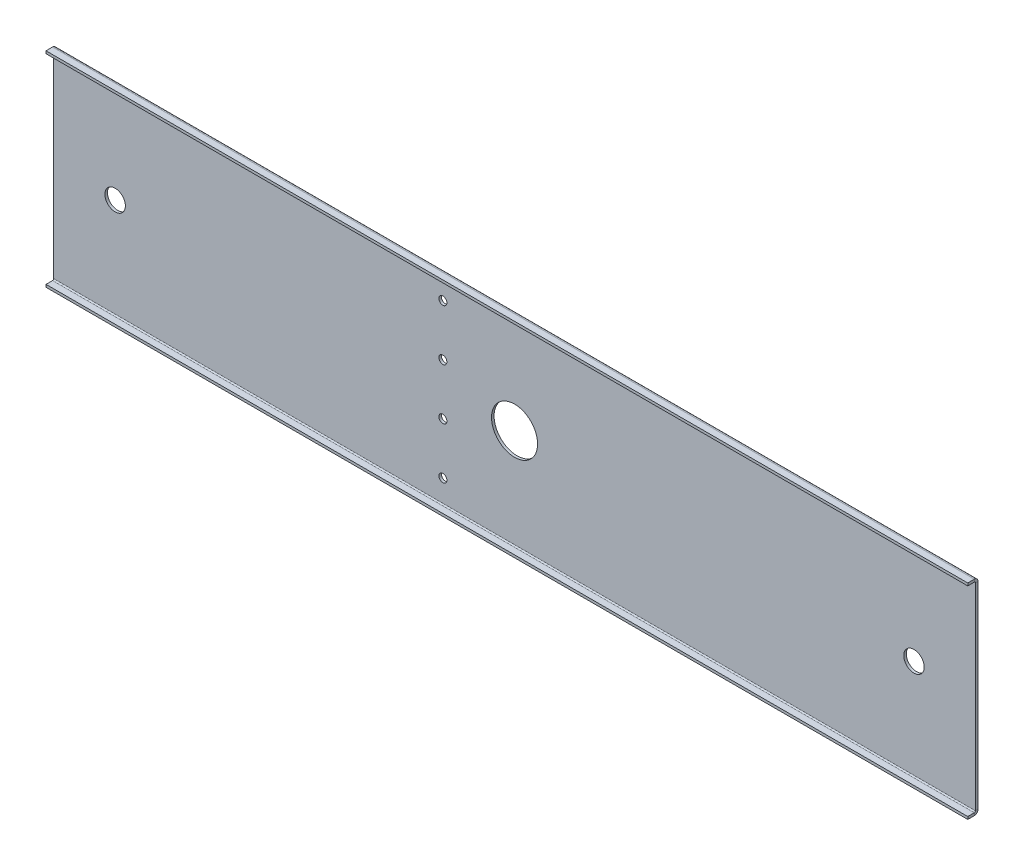
ISO-10303-21;
HEADER;
FILE_DESCRIPTION(('STEP AP214'),'2;1');
FILE_NAME('part.step','',(''),(''),'','','');
FILE_SCHEMA(('AUTOMOTIVE_DESIGN { 1 0 10303 214 1 1 1 1 }'));
ENDSEC;
DATA;
#1=APPLICATION_CONTEXT('core data for automotive mechanical design processes');
#2=APPLICATION_PROTOCOL_DEFINITION('international standard','automotive_design',2000,#1);
#3=PRODUCT_CONTEXT('',#1,'mechanical');
#4=PRODUCT('Part','Part','',(#3));
#5=PRODUCT_RELATED_PRODUCT_CATEGORY('part','',(#4));
#6=PRODUCT_DEFINITION_FORMATION('','',#4);
#7=PRODUCT_DEFINITION_CONTEXT('part definition',#1,'design');
#8=PRODUCT_DEFINITION('design','',#6,#7);
#9=PRODUCT_DEFINITION_SHAPE('','',#8);
#10=(LENGTH_UNIT() NAMED_UNIT(*) SI_UNIT(.MILLI.,.METRE.));
#11=(NAMED_UNIT(*) PLANE_ANGLE_UNIT() SI_UNIT($,.RADIAN.));
#12=(NAMED_UNIT(*) SI_UNIT($,.STERADIAN.) SOLID_ANGLE_UNIT());
#13=UNCERTAINTY_MEASURE_WITH_UNIT(LENGTH_MEASURE(1.E-05),#10,'distance_accuracy_value','');
#14=(GEOMETRIC_REPRESENTATION_CONTEXT(3) GLOBAL_UNCERTAINTY_ASSIGNED_CONTEXT((#13)) GLOBAL_UNIT_ASSIGNED_CONTEXT((#10,
#11,#12)) REPRESENTATION_CONTEXT('',''));
#15=CARTESIAN_POINT('',(0.,0.,0.));
#16=DIRECTION('',(0.,0.,1.));
#17=DIRECTION('',(1.,0.,0.));
#18=AXIS2_PLACEMENT_3D('',#15,#16,#17);
#19=CARTESIAN_POINT('',(0.,0.,47.3075));
#20=DIRECTION('',(0.,0.,1.));
#21=DIRECTION('',(1.,0.,0.));
#22=AXIS2_PLACEMENT_3D('',#19,#20,#21);
#23=PLANE('',#22);
#24=CARTESIAN_POINT('',(-44.45,47.625,47.3075));
#25=DIRECTION('',(0.,0.,1.));
#26=DIRECTION('',(1.,0.,0.));
#27=AXIS2_PLACEMENT_3D('',#24,#25,#26);
#28=CIRCLE('',#27,2.4892);
#29=CARTESIAN_POINT('',(-41.9608,47.625,47.3075));
#30=VERTEX_POINT('',#29);
#31=EDGE_CURVE('E636',#30,#30,#28,.T.);
#32=ORIENTED_EDGE('',*,*,#31,.F.);
#33=EDGE_LOOP('',(#32));
#34=FACE_BOUND('',#33,.T.);
#35=CARTESIAN_POINT('',(-44.45,15.875,47.3075));
#36=DIRECTION('',(0.,0.,1.));
#37=DIRECTION('',(1.,0.,0.));
#38=AXIS2_PLACEMENT_3D('',#35,#36,#37);
#39=CIRCLE('',#38,2.4892);
#40=CARTESIAN_POINT('',(-41.9608,15.875,47.3075));
#41=VERTEX_POINT('',#40);
#42=EDGE_CURVE('E630',#41,#41,#39,.T.);
#43=ORIENTED_EDGE('',*,*,#42,.F.);
#44=EDGE_LOOP('',(#43));
#45=FACE_BOUND('',#44,.T.);
#46=CARTESIAN_POINT('',(-44.45,-15.875,47.3075));
#47=DIRECTION('',(0.,0.,1.));
#48=DIRECTION('',(1.,0.,0.));
#49=AXIS2_PLACEMENT_3D('',#46,#47,#48);
#50=CIRCLE('',#49,2.4892);
#51=CARTESIAN_POINT('',(-41.9608,-15.875,47.3075));
#52=VERTEX_POINT('',#51);
#53=EDGE_CURVE('E623',#52,#52,#50,.T.);
#54=ORIENTED_EDGE('',*,*,#53,.F.);
#55=EDGE_LOOP('',(#54));
#56=FACE_BOUND('',#55,.T.);
#57=CARTESIAN_POINT('',(-44.45,-47.625,47.3075));
#58=DIRECTION('',(0.,0.,1.));
#59=DIRECTION('',(1.,0.,0.));
#60=AXIS2_PLACEMENT_3D('',#57,#58,#59);
#61=CIRCLE('',#60,2.4892);
#62=CARTESIAN_POINT('',(-41.9608,-47.625,47.3075));
#63=VERTEX_POINT('',#62);
#64=EDGE_CURVE('E624',#63,#63,#61,.T.);
#65=ORIENTED_EDGE('',*,*,#64,.F.);
#66=EDGE_LOOP('',(#65));
#67=FACE_BOUND('',#66,.T.);
#68=CARTESIAN_POINT('',(0.,0.,47.3075));
#69=DIRECTION('',(0.,0.,1.));
#70=DIRECTION('',(1.,0.,0.));
#71=AXIS2_PLACEMENT_3D('',#68,#69,#70);
#72=CIRCLE('',#71,14.2875);
#73=CARTESIAN_POINT('',(14.2875,0.,47.3075));
#74=VERTEX_POINT('',#73);
#75=EDGE_CURVE('E249',#74,#74,#72,.T.);
#76=ORIENTED_EDGE('',*,*,#75,.F.);
#77=EDGE_LOOP('',(#76));
#78=FACE_BOUND('',#77,.T.);
#79=CARTESIAN_POINT('',(-247.641580502809,0.,47.3075));
#80=DIRECTION('',(0.,0.,1.));
#81=DIRECTION('',(1.,0.,0.));
#82=AXIS2_PLACEMENT_3D('',#79,#80,#81);
#83=CIRCLE('',#82,6.35);
#84=CARTESIAN_POINT('',(-241.291580502809,0.,47.3075));
#85=VERTEX_POINT('',#84);
#86=EDGE_CURVE('E255',#85,#85,#83,.T.);
#87=ORIENTED_EDGE('',*,*,#86,.F.);
#88=EDGE_LOOP('',(#87));
#89=FACE_BOUND('',#88,.T.);
#90=CARTESIAN_POINT('',(247.641580502809,0.,47.3075));
#91=DIRECTION('',(0.,0.,1.));
#92=DIRECTION('',(1.,0.,0.));
#93=AXIS2_PLACEMENT_3D('',#90,#91,#92);
#94=CIRCLE('',#93,6.35);
#95=CARTESIAN_POINT('',(253.991580502809,0.,47.3075));
#96=VERTEX_POINT('',#95);
#97=EDGE_CURVE('E243',#96,#96,#94,.T.);
#98=ORIENTED_EDGE('',*,*,#97,.F.);
#99=EDGE_LOOP('',(#98));
#100=FACE_BOUND('',#99,.T.);
#101=DIRECTION('',(0.,-1.,0.));
#102=VECTOR('',#101,1.);
#103=CARTESIAN_POINT('',(-285.75,63.5,47.3075));
#104=LINE('',#103,#102);
#105=CARTESIAN_POINT('',(-285.75,61.1759,47.3075));
#106=VERTEX_POINT('',#105);
#107=CARTESIAN_POINT('',(-285.75,-61.1759,47.3075));
#108=VERTEX_POINT('',#107);
#109=EDGE_CURVE('E44',#106,#108,#104,.T.);
#110=ORIENTED_EDGE('',*,*,#109,.T.);
#111=DIRECTION('',(1.,0.,0.));
#112=VECTOR('',#111,1.);
#113=CARTESIAN_POINT('',(285.75,-61.1759,47.3075));
#114=LINE('',#113,#112);
#115=CARTESIAN_POINT('',(285.75,-61.1759,47.3075));
#116=VERTEX_POINT('',#115);
#117=EDGE_CURVE('E179',#116,#108,#114,.F.);
#118=ORIENTED_EDGE('',*,*,#117,.F.);
#119=DIRECTION('',(0.,1.,0.));
#120=VECTOR('',#119,1.);
#121=CARTESIAN_POINT('',(285.75,63.5,47.3075));
#122=LINE('',#121,#120);
#123=CARTESIAN_POINT('',(285.75,61.1759,47.3075));
#124=VERTEX_POINT('',#123);
#125=EDGE_CURVE('E11',#116,#124,#122,.T.);
#126=ORIENTED_EDGE('',*,*,#125,.T.);
#127=DIRECTION('',(-1.,0.,0.));
#128=VECTOR('',#127,1.);
#129=CARTESIAN_POINT('',(-285.75,61.1759,47.3075));
#130=LINE('',#129,#128);
#131=EDGE_CURVE('E232',#106,#124,#130,.F.);
#132=ORIENTED_EDGE('',*,*,#131,.F.);
#133=EDGE_LOOP('',(#110,#118,#126,#132));
#134=FACE_BOUND('',#133,.T.);
#135=ADVANCED_FACE('F35',(#34,#45,#56,#67,#78,#89,#100,#134),#23,.T.);
#136=CARTESIAN_POINT('',(0.,0.,45.72));
#137=DIRECTION('',(0.,0.,1.));
#138=DIRECTION('',(1.,0.,0.));
#139=AXIS2_PLACEMENT_3D('',#136,#137,#138);
#140=PLANE('',#139);
#141=CARTESIAN_POINT('',(-44.45,47.625,45.72));
#142=DIRECTION('',(0.,0.,1.));
#143=DIRECTION('',(1.,0.,0.));
#144=AXIS2_PLACEMENT_3D('',#141,#142,#143);
#145=CIRCLE('',#144,2.4892);
#146=CARTESIAN_POINT('',(-41.9608,47.625,45.72));
#147=VERTEX_POINT('',#146);
#148=EDGE_CURVE('E167',#147,#147,#145,.F.);
#149=ORIENTED_EDGE('',*,*,#148,.F.);
#150=EDGE_LOOP('',(#149));
#151=FACE_BOUND('',#150,.T.);
#152=CARTESIAN_POINT('',(-44.45,15.875,45.72));
#153=DIRECTION('',(0.,0.,1.));
#154=DIRECTION('',(1.,0.,0.));
#155=AXIS2_PLACEMENT_3D('',#152,#153,#154);
#156=CIRCLE('',#155,2.4892);
#157=CARTESIAN_POINT('',(-41.9608,15.875,45.72));
#158=VERTEX_POINT('',#157);
#159=EDGE_CURVE('E633',#158,#158,#156,.F.);
#160=ORIENTED_EDGE('',*,*,#159,.F.);
#161=EDGE_LOOP('',(#160));
#162=FACE_BOUND('',#161,.T.);
#163=CARTESIAN_POINT('',(-44.45,-15.875,45.72));
#164=DIRECTION('',(0.,0.,1.));
#165=DIRECTION('',(1.,0.,0.));
#166=AXIS2_PLACEMENT_3D('',#163,#164,#165);
#167=CIRCLE('',#166,2.4892);
#168=CARTESIAN_POINT('',(-41.9608,-15.875,45.72));
#169=VERTEX_POINT('',#168);
#170=EDGE_CURVE('E627',#169,#169,#167,.F.);
#171=ORIENTED_EDGE('',*,*,#170,.F.);
#172=EDGE_LOOP('',(#171));
#173=FACE_BOUND('',#172,.T.);
#174=CARTESIAN_POINT('',(-44.45,-47.625,45.72));
#175=DIRECTION('',(0.,0.,1.));
#176=DIRECTION('',(1.,0.,0.));
#177=AXIS2_PLACEMENT_3D('',#174,#175,#176);
#178=CIRCLE('',#177,2.4892);
#179=CARTESIAN_POINT('',(-41.9608,-47.625,45.72));
#180=VERTEX_POINT('',#179);
#181=EDGE_CURVE('E620',#180,#180,#178,.F.);
#182=ORIENTED_EDGE('',*,*,#181,.F.);
#183=EDGE_LOOP('',(#182));
#184=FACE_BOUND('',#183,.T.);
#185=CARTESIAN_POINT('',(-247.641580502809,0.,45.72));
#186=DIRECTION('',(0.,0.,1.));
#187=DIRECTION('',(1.,0.,0.));
#188=AXIS2_PLACEMENT_3D('',#185,#186,#187);
#189=CIRCLE('',#188,6.35);
#190=CARTESIAN_POINT('',(-241.291580502809,0.,45.72));
#191=VERTEX_POINT('',#190);
#192=EDGE_CURVE('E252',#191,#191,#189,.T.);
#193=ORIENTED_EDGE('',*,*,#192,.T.);
#194=EDGE_LOOP('',(#193));
#195=FACE_BOUND('',#194,.T.);
#196=CARTESIAN_POINT('',(0.,0.,45.72));
#197=DIRECTION('',(0.,0.,1.));
#198=DIRECTION('',(1.,0.,0.));
#199=AXIS2_PLACEMENT_3D('',#196,#197,#198);
#200=CIRCLE('',#199,14.2875);
#201=CARTESIAN_POINT('',(14.2875,0.,45.72));
#202=VERTEX_POINT('',#201);
#203=EDGE_CURVE('E246',#202,#202,#200,.T.);
#204=ORIENTED_EDGE('',*,*,#203,.T.);
#205=EDGE_LOOP('',(#204));
#206=FACE_BOUND('',#205,.T.);
#207=CARTESIAN_POINT('',(247.641580502809,0.,45.72));
#208=DIRECTION('',(0.,0.,1.));
#209=DIRECTION('',(1.,0.,0.));
#210=AXIS2_PLACEMENT_3D('',#207,#208,#209);
#211=CIRCLE('',#210,6.35);
#212=CARTESIAN_POINT('',(253.991580502809,0.,45.72));
#213=VERTEX_POINT('',#212);
#214=EDGE_CURVE('E240',#213,#213,#211,.T.);
#215=ORIENTED_EDGE('',*,*,#214,.T.);
#216=EDGE_LOOP('',(#215));
#217=FACE_BOUND('',#216,.T.);
#218=DIRECTION('',(1.,0.,0.));
#219=VECTOR('',#218,1.);
#220=CARTESIAN_POINT('',(285.75,-61.1759,45.72));
#221=LINE('',#220,#219);
#222=CARTESIAN_POINT('',(285.75,-61.1759,45.72));
#223=VERTEX_POINT('',#222);
#224=CARTESIAN_POINT('',(-285.75,-61.1759,45.72));
#225=VERTEX_POINT('',#224);
#226=EDGE_CURVE('E60',#223,#225,#221,.F.);
#227=ORIENTED_EDGE('',*,*,#226,.T.);
#228=DIRECTION('',(0.,-1.,0.));
#229=VECTOR('',#228,1.);
#230=CARTESIAN_POINT('',(-285.75,63.5,45.72));
#231=LINE('',#230,#229);
#232=CARTESIAN_POINT('',(-285.75,61.1759,45.72));
#233=VERTEX_POINT('',#232);
#234=EDGE_CURVE('E258',#233,#225,#231,.T.);
#235=ORIENTED_EDGE('',*,*,#234,.F.);
#236=DIRECTION('',(-1.,0.,0.));
#237=VECTOR('',#236,1.);
#238=CARTESIAN_POINT('',(-285.75,61.1759,45.72));
#239=LINE('',#238,#237);
#240=CARTESIAN_POINT('',(285.75,61.1759,45.72));
#241=VERTEX_POINT('',#240);
#242=EDGE_CURVE('E219',#233,#241,#239,.F.);
#243=ORIENTED_EDGE('',*,*,#242,.T.);
#244=DIRECTION('',(0.,1.,0.));
#245=VECTOR('',#244,1.);
#246=CARTESIAN_POINT('',(285.75,63.5,45.72));
#247=LINE('',#246,#245);
#248=EDGE_CURVE('E39',#223,#241,#247,.T.);
#249=ORIENTED_EDGE('',*,*,#248,.F.);
#250=EDGE_LOOP('',(#227,#235,#243,#249));
#251=FACE_BOUND('',#250,.T.);
#252=ADVANCED_FACE('F266',(#151,#162,#173,#184,#195,#206,#217,#251),#140,.F.);
#253=CARTESIAN_POINT('',(-285.75,63.5,47.3075));
#254=DIRECTION('',(1.,0.,0.));
#255=DIRECTION('',(0.,0.,-1.));
#256=AXIS2_PLACEMENT_3D('',#253,#254,#255);
#257=PLANE('',#256);
#258=DIRECTION('',(0.,0.,-1.));
#259=VECTOR('',#258,1.);
#260=CARTESIAN_POINT('',(-285.75,-61.1759,47.3075));
#261=LINE('',#260,#259);
#262=EDGE_CURVE('E52',#108,#225,#261,.T.);
#263=ORIENTED_EDGE('',*,*,#262,.F.);
#264=ORIENTED_EDGE('',*,*,#109,.F.);
#265=DIRECTION('',(0.,0.,-1.));
#266=VECTOR('',#265,1.);
#267=CARTESIAN_POINT('',(-285.75,61.1759,47.3075));
#268=LINE('',#267,#266);
#269=EDGE_CURVE('E226',#106,#233,#268,.T.);
#270=ORIENTED_EDGE('',*,*,#269,.T.);
#271=ORIENTED_EDGE('',*,*,#234,.T.);
#272=EDGE_LOOP('',(#263,#264,#270,#271));
#273=FACE_BOUND('',#272,.T.);
#274=ADVANCED_FACE('F37',(#273),#257,.F.);
#275=CARTESIAN_POINT('',(285.75,63.5,47.3075));
#276=DIRECTION('',(-1.,0.,0.));
#277=DIRECTION('',(0.,0.,1.));
#278=AXIS2_PLACEMENT_3D('',#275,#276,#277);
#279=PLANE('',#278);
#280=DIRECTION('',(0.,0.,-1.));
#281=VECTOR('',#280,1.);
#282=CARTESIAN_POINT('',(285.75,-61.1759,47.3075));
#283=LINE('',#282,#281);
#284=EDGE_CURVE('E173',#116,#223,#283,.T.);
#285=ORIENTED_EDGE('',*,*,#284,.T.);
#286=ORIENTED_EDGE('',*,*,#248,.T.);
#287=DIRECTION('',(0.,0.,-1.));
#288=VECTOR('',#287,1.);
#289=CARTESIAN_POINT('',(285.75,61.1759,47.3075));
#290=LINE('',#289,#288);
#291=EDGE_CURVE('E237',#124,#241,#290,.T.);
#292=ORIENTED_EDGE('',*,*,#291,.F.);
#293=ORIENTED_EDGE('',*,*,#125,.F.);
#294=EDGE_LOOP('',(#285,#286,#292,#293));
#295=FACE_BOUND('',#294,.T.);
#296=ADVANCED_FACE('F263',(#295),#279,.F.);
#297=CARTESIAN_POINT('',(-247.641580502809,0.,47.3075));
#298=DIRECTION('',(0.,0.,-1.));
#299=DIRECTION('',(-1.,0.,0.));
#300=AXIS2_PLACEMENT_3D('',#297,#298,#299);
#301=CYLINDRICAL_SURFACE('',#300,6.35);
#302=ORIENTED_EDGE('',*,*,#86,.T.);
#303=EDGE_LOOP('',(#302));
#304=FACE_BOUND('',#303,.T.);
#305=ORIENTED_EDGE('',*,*,#192,.F.);
#306=EDGE_LOOP('',(#305));
#307=FACE_BOUND('',#306,.T.);
#308=ADVANCED_FACE('F317',(#304,#307),#301,.F.);
#309=CARTESIAN_POINT('',(0.,0.,47.3075));
#310=DIRECTION('',(0.,0.,-1.));
#311=DIRECTION('',(-1.,0.,0.));
#312=AXIS2_PLACEMENT_3D('',#309,#310,#311);
#313=CYLINDRICAL_SURFACE('',#312,14.2875);
#314=ORIENTED_EDGE('',*,*,#75,.T.);
#315=EDGE_LOOP('',(#314));
#316=FACE_BOUND('',#315,.T.);
#317=ORIENTED_EDGE('',*,*,#203,.F.);
#318=EDGE_LOOP('',(#317));
#319=FACE_BOUND('',#318,.T.);
#320=ADVANCED_FACE('F324',(#316,#319),#313,.F.);
#321=CARTESIAN_POINT('',(247.641580502809,0.,47.3075));
#322=DIRECTION('',(0.,0.,-1.));
#323=DIRECTION('',(-1.,0.,0.));
#324=AXIS2_PLACEMENT_3D('',#321,#322,#323);
#325=CYLINDRICAL_SURFACE('',#324,6.35);
#326=ORIENTED_EDGE('',*,*,#97,.T.);
#327=EDGE_LOOP('',(#326));
#328=FACE_BOUND('',#327,.T.);
#329=ORIENTED_EDGE('',*,*,#214,.F.);
#330=EDGE_LOOP('',(#329));
#331=FACE_BOUND('',#330,.T.);
#332=ADVANCED_FACE('F533',(#328,#331),#325,.F.);
#333=CARTESIAN_POINT('',(285.75,61.1759,48.0441));
#334=DIRECTION('',(1.,0.,0.));
#335=DIRECTION('',(0.,0.,-1.));
#336=AXIS2_PLACEMENT_3D('',#333,#334,#335);
#337=PLANE('',#336);
#338=DIRECTION('',(0.,-1.,0.));
#339=VECTOR('',#338,1.);
#340=CARTESIAN_POINT('',(285.75,63.5,48.0441));
#341=LINE('',#340,#339);
#342=CARTESIAN_POINT('',(285.75,61.9125,48.0441));
#343=VERTEX_POINT('',#342);
#344=CARTESIAN_POINT('',(285.75,63.5,48.0441));
#345=VERTEX_POINT('',#344);
#346=EDGE_CURVE('E186',#343,#345,#341,.F.);
#347=ORIENTED_EDGE('',*,*,#346,.F.);
#348=CARTESIAN_POINT('',(285.75,61.1759,48.0441));
#349=DIRECTION('',(-1.,0.,0.));
#350=DIRECTION('',(0.,0.,1.));
#351=AXIS2_PLACEMENT_3D('',#348,#349,#350);
#352=CIRCLE('',#351,0.736599999999997);
#353=EDGE_CURVE('E229',#124,#343,#352,.F.);
#354=ORIENTED_EDGE('',*,*,#353,.F.);
#355=ORIENTED_EDGE('',*,*,#291,.T.);
#356=CARTESIAN_POINT('',(285.75,61.1759,48.0441));
#357=DIRECTION('',(-1.,0.,0.));
#358=DIRECTION('',(0.,0.,1.));
#359=AXIS2_PLACEMENT_3D('',#356,#357,#358);
#360=CIRCLE('',#359,2.3241);
#361=EDGE_CURVE('E222',#241,#345,#360,.F.);
#362=ORIENTED_EDGE('',*,*,#361,.T.);
#363=EDGE_LOOP('',(#347,#354,#355,#362));
#364=FACE_BOUND('',#363,.T.);
#365=ADVANCED_FACE('F271',(#364),#337,.T.);
#366=CARTESIAN_POINT('',(-285.75,61.1759,48.0441));
#367=DIRECTION('',(1.,0.,0.));
#368=DIRECTION('',(0.,0.,-1.));
#369=AXIS2_PLACEMENT_3D('',#366,#367,#368);
#370=PLANE('',#369);
#371=CARTESIAN_POINT('',(-285.75,61.1759,48.0441));
#372=DIRECTION('',(-1.,0.,0.));
#373=DIRECTION('',(0.,0.,1.));
#374=AXIS2_PLACEMENT_3D('',#371,#372,#373);
#375=CIRCLE('',#374,0.736599999999997);
#376=CARTESIAN_POINT('',(-285.75,61.9125,48.0441));
#377=VERTEX_POINT('',#376);
#378=EDGE_CURVE('E192',#377,#106,#375,.T.);
#379=ORIENTED_EDGE('',*,*,#378,.F.);
#380=DIRECTION('',(0.,-1.,0.));
#381=VECTOR('',#380,1.);
#382=CARTESIAN_POINT('',(-285.75,61.9125,48.0441));
#383=LINE('',#382,#381);
#384=CARTESIAN_POINT('',(-285.75,63.5,48.0441));
#385=VERTEX_POINT('',#384);
#386=EDGE_CURVE('E212',#377,#385,#383,.F.);
#387=ORIENTED_EDGE('',*,*,#386,.T.);
#388=CARTESIAN_POINT('',(-285.75,61.1759,48.0441));
#389=DIRECTION('',(-1.,0.,0.));
#390=DIRECTION('',(0.,0.,1.));
#391=AXIS2_PLACEMENT_3D('',#388,#389,#390);
#392=CIRCLE('',#391,2.3241);
#393=EDGE_CURVE('E223',#385,#233,#392,.T.);
#394=ORIENTED_EDGE('',*,*,#393,.T.);
#395=ORIENTED_EDGE('',*,*,#269,.F.);
#396=EDGE_LOOP('',(#379,#387,#394,#395));
#397=FACE_BOUND('',#396,.T.);
#398=ADVANCED_FACE('F554',(#397),#370,.F.);
#399=CARTESIAN_POINT('',(-285.75,61.1759,48.0441));
#400=DIRECTION('',(-1.,0.,0.));
#401=DIRECTION('',(0.,1.,0.));
#402=AXIS2_PLACEMENT_3D('',#399,#400,#401);
#403=CYLINDRICAL_SURFACE('',#402,2.3241);
#404=ORIENTED_EDGE('',*,*,#242,.F.);
#405=ORIENTED_EDGE('',*,*,#393,.F.);
#406=DIRECTION('',(-1.,0.,0.));
#407=VECTOR('',#406,1.);
#408=CARTESIAN_POINT('',(285.75,63.5,48.0441));
#409=LINE('',#408,#407);
#410=EDGE_CURVE('E210',#385,#345,#409,.F.);
#411=ORIENTED_EDGE('',*,*,#410,.T.);
#412=ORIENTED_EDGE('',*,*,#361,.F.);
#413=EDGE_LOOP('',(#404,#405,#411,#412));
#414=FACE_BOUND('',#413,.T.);
#415=ADVANCED_FACE('F272',(#414),#403,.T.);
#416=CARTESIAN_POINT('',(-285.75,61.1759,48.0441));
#417=DIRECTION('',(-1.,0.,0.));
#418=DIRECTION('',(0.,1.,0.));
#419=AXIS2_PLACEMENT_3D('',#416,#417,#418);
#420=CYLINDRICAL_SURFACE('',#419,0.736599999999997);
#421=ORIENTED_EDGE('',*,*,#131,.T.);
#422=ORIENTED_EDGE('',*,*,#353,.T.);
#423=DIRECTION('',(-1.,0.,0.));
#424=VECTOR('',#423,1.);
#425=CARTESIAN_POINT('',(285.75,61.9125,48.0441));
#426=LINE('',#425,#424);
#427=EDGE_CURVE('E215',#343,#377,#426,.T.);
#428=ORIENTED_EDGE('',*,*,#427,.T.);
#429=ORIENTED_EDGE('',*,*,#378,.T.);
#430=EDGE_LOOP('',(#421,#422,#428,#429));
#431=FACE_BOUND('',#430,.T.);
#432=ADVANCED_FACE('F293',(#431),#420,.F.);
#433=CARTESIAN_POINT('',(285.75,63.5,47.3075));
#434=DIRECTION('',(-1.,0.,0.));
#435=DIRECTION('',(0.,0.,1.));
#436=AXIS2_PLACEMENT_3D('',#433,#434,#435);
#437=PLANE('',#436);
#438=ORIENTED_EDGE('',*,*,#346,.T.);
#439=DIRECTION('',(0.,0.,-1.));
#440=VECTOR('',#439,1.);
#441=CARTESIAN_POINT('',(285.75,63.4999999999999,-1.90579897396272E-13));
#442=LINE('',#441,#440);
#443=CARTESIAN_POINT('',(285.75,63.5,52.07));
#444=VERTEX_POINT('',#443);
#445=EDGE_CURVE('E200',#444,#345,#442,.T.);
#446=ORIENTED_EDGE('',*,*,#445,.F.);
#447=DIRECTION('',(0.,-1.,0.));
#448=VECTOR('',#447,1.);
#449=CARTESIAN_POINT('',(285.75,63.5,52.07));
#450=LINE('',#449,#448);
#451=CARTESIAN_POINT('',(285.75,61.9125,52.07));
#452=VERTEX_POINT('',#451);
#453=EDGE_CURVE('E193',#444,#452,#450,.T.);
#454=ORIENTED_EDGE('',*,*,#453,.T.);
#455=DIRECTION('',(0.,0.,1.));
#456=VECTOR('',#455,1.);
#457=CARTESIAN_POINT('',(285.75,61.9125,47.3075));
#458=LINE('',#457,#456);
#459=EDGE_CURVE('E207',#452,#343,#458,.F.);
#460=ORIENTED_EDGE('',*,*,#459,.T.);
#461=EDGE_LOOP('',(#438,#446,#454,#460));
#462=FACE_BOUND('',#461,.T.);
#463=ADVANCED_FACE('F290',(#462),#437,.F.);
#464=CARTESIAN_POINT('',(-285.75,63.5,52.07));
#465=DIRECTION('',(1.,0.,0.));
#466=DIRECTION('',(0.,0.,-1.));
#467=AXIS2_PLACEMENT_3D('',#464,#465,#466);
#468=PLANE('',#467);
#469=ORIENTED_EDGE('',*,*,#386,.F.);
#470=DIRECTION('',(0.,0.,-1.));
#471=VECTOR('',#470,1.);
#472=CARTESIAN_POINT('',(-285.75,61.9125,52.07));
#473=LINE('',#472,#471);
#474=CARTESIAN_POINT('',(-285.75,61.9125,52.07));
#475=VERTEX_POINT('',#474);
#476=EDGE_CURVE('E205',#377,#475,#473,.F.);
#477=ORIENTED_EDGE('',*,*,#476,.T.);
#478=DIRECTION('',(0.,-1.,0.));
#479=VECTOR('',#478,1.);
#480=CARTESIAN_POINT('',(-285.75,63.5,52.07));
#481=LINE('',#480,#479);
#482=CARTESIAN_POINT('',(-285.75,63.5,52.07));
#483=VERTEX_POINT('',#482);
#484=EDGE_CURVE('E189',#483,#475,#481,.T.);
#485=ORIENTED_EDGE('',*,*,#484,.F.);
#486=DIRECTION('',(0.,0.,1.));
#487=VECTOR('',#486,1.);
#488=CARTESIAN_POINT('',(-285.75,63.4999999999999,-1.90579897396272E-13));
#489=LINE('',#488,#487);
#490=EDGE_CURVE('E198',#385,#483,#489,.T.);
#491=ORIENTED_EDGE('',*,*,#490,.F.);
#492=EDGE_LOOP('',(#469,#477,#485,#491));
#493=FACE_BOUND('',#492,.T.);
#494=ADVANCED_FACE('F281',(#493),#468,.F.);
#495=CARTESIAN_POINT('',(0.,63.4999999999999,-1.90579897396272E-13));
#496=DIRECTION('',(0.,-1.,0.));
#497=DIRECTION('',(0.,0.,-1.));
#498=AXIS2_PLACEMENT_3D('',#495,#496,#497);
#499=PLANE('',#498);
#500=ORIENTED_EDGE('',*,*,#410,.F.);
#501=ORIENTED_EDGE('',*,*,#490,.T.);
#502=DIRECTION('',(1.,0.,0.));
#503=VECTOR('',#502,1.);
#504=CARTESIAN_POINT('',(0.,63.5,52.07));
#505=LINE('',#504,#503);
#506=EDGE_CURVE('E196',#483,#444,#505,.T.);
#507=ORIENTED_EDGE('',*,*,#506,.T.);
#508=ORIENTED_EDGE('',*,*,#445,.T.);
#509=EDGE_LOOP('',(#500,#501,#507,#508));
#510=FACE_BOUND('',#509,.T.);
#511=ADVANCED_FACE('F276',(#510),#499,.F.);
#512=CARTESIAN_POINT('',(0.,61.9124999999999,-1.85037170770859E-13));
#513=DIRECTION('',(0.,-1.,0.));
#514=DIRECTION('',(0.,0.,-1.));
#515=AXIS2_PLACEMENT_3D('',#512,#513,#514);
#516=PLANE('',#515);
#517=ORIENTED_EDGE('',*,*,#476,.F.);
#518=ORIENTED_EDGE('',*,*,#427,.F.);
#519=ORIENTED_EDGE('',*,*,#459,.F.);
#520=DIRECTION('',(-1.,0.,0.));
#521=VECTOR('',#520,1.);
#522=CARTESIAN_POINT('',(285.75,61.9125,52.07));
#523=LINE('',#522,#521);
#524=EDGE_CURVE('E203',#475,#452,#523,.F.);
#525=ORIENTED_EDGE('',*,*,#524,.F.);
#526=EDGE_LOOP('',(#517,#518,#519,#525));
#527=FACE_BOUND('',#526,.T.);
#528=ADVANCED_FACE('F296',(#527),#516,.T.);
#529=CARTESIAN_POINT('',(285.75,63.5,52.07));
#530=DIRECTION('',(0.,0.,-1.));
#531=DIRECTION('',(0.,1.,0.));
#532=AXIS2_PLACEMENT_3D('',#529,#530,#531);
#533=PLANE('',#532);
#534=ORIENTED_EDGE('',*,*,#524,.T.);
#535=ORIENTED_EDGE('',*,*,#453,.F.);
#536=ORIENTED_EDGE('',*,*,#506,.F.);
#537=ORIENTED_EDGE('',*,*,#484,.T.);
#538=EDGE_LOOP('',(#534,#535,#536,#537));
#539=FACE_BOUND('',#538,.T.);
#540=ADVANCED_FACE('F287',(#539),#533,.F.);
#541=CARTESIAN_POINT('',(-285.75,-61.1759,48.0441));
#542=DIRECTION('',(-1.,0.,0.));
#543=DIRECTION('',(0.,0.,1.));
#544=AXIS2_PLACEMENT_3D('',#541,#542,#543);
#545=PLANE('',#544);
#546=DIRECTION('',(0.,1.,0.));
#547=VECTOR('',#546,1.);
#548=CARTESIAN_POINT('',(-285.75,-63.5,48.0441));
#549=LINE('',#548,#547);
#550=CARTESIAN_POINT('',(-285.75,-61.9125,48.0441));
#551=VERTEX_POINT('',#550);
#552=CARTESIAN_POINT('',(-285.75,-63.5,48.0441));
#553=VERTEX_POINT('',#552);
#554=EDGE_CURVE('E150',#551,#553,#549,.F.);
#555=ORIENTED_EDGE('',*,*,#554,.F.);
#556=CARTESIAN_POINT('',(-285.75,-61.1759,48.0441));
#557=DIRECTION('',(1.,0.,0.));
#558=DIRECTION('',(0.,0.,-1.));
#559=AXIS2_PLACEMENT_3D('',#556,#557,#558);
#560=CIRCLE('',#559,0.736599999999997);
#561=EDGE_CURVE('E176',#108,#551,#560,.F.);
#562=ORIENTED_EDGE('',*,*,#561,.F.);
#563=ORIENTED_EDGE('',*,*,#262,.T.);
#564=CARTESIAN_POINT('',(-285.75,-61.1759,48.0441));
#565=DIRECTION('',(1.,0.,0.));
#566=DIRECTION('',(0.,0.,-1.));
#567=AXIS2_PLACEMENT_3D('',#564,#565,#566);
#568=CIRCLE('',#567,2.3241);
#569=EDGE_CURVE('E169',#225,#553,#568,.F.);
#570=ORIENTED_EDGE('',*,*,#569,.T.);
#571=EDGE_LOOP('',(#555,#562,#563,#570));
#572=FACE_BOUND('',#571,.T.);
#573=ADVANCED_FACE('F303',(#572),#545,.T.);
#574=CARTESIAN_POINT('',(285.75,-61.1759,48.0441));
#575=DIRECTION('',(-1.,0.,0.));
#576=DIRECTION('',(0.,0.,1.));
#577=AXIS2_PLACEMENT_3D('',#574,#575,#576);
#578=PLANE('',#577);
#579=CARTESIAN_POINT('',(285.75,-61.1759,48.0441));
#580=DIRECTION('',(1.,0.,0.));
#581=DIRECTION('',(0.,0.,-1.));
#582=AXIS2_PLACEMENT_3D('',#579,#580,#581);
#583=CIRCLE('',#582,0.736599999999997);
#584=CARTESIAN_POINT('',(285.75,-61.9125,48.0441));
#585=VERTEX_POINT('',#584);
#586=EDGE_CURVE('E182',#585,#116,#583,.T.);
#587=ORIENTED_EDGE('',*,*,#586,.F.);
#588=DIRECTION('',(0.,1.,0.));
#589=VECTOR('',#588,1.);
#590=CARTESIAN_POINT('',(285.75,-61.9125,48.0441));
#591=LINE('',#590,#589);
#592=CARTESIAN_POINT('',(285.75,-63.5,48.0441));
#593=VERTEX_POINT('',#592);
#594=EDGE_CURVE('E161',#585,#593,#591,.F.);
#595=ORIENTED_EDGE('',*,*,#594,.T.);
#596=CARTESIAN_POINT('',(285.75,-61.1759,48.0441));
#597=DIRECTION('',(1.,0.,0.));
#598=DIRECTION('',(0.,0.,-1.));
#599=AXIS2_PLACEMENT_3D('',#596,#597,#598);
#600=CIRCLE('',#599,2.3241);
#601=EDGE_CURVE('E170',#593,#223,#600,.T.);
#602=ORIENTED_EDGE('',*,*,#601,.T.);
#603=ORIENTED_EDGE('',*,*,#284,.F.);
#604=EDGE_LOOP('',(#587,#595,#602,#603));
#605=FACE_BOUND('',#604,.T.);
#606=ADVANCED_FACE('F373',(#605),#578,.F.);
#607=CARTESIAN_POINT('',(285.75,-61.1759,48.0441));
#608=DIRECTION('',(1.,0.,0.));
#609=DIRECTION('',(0.,-1.,0.));
#610=AXIS2_PLACEMENT_3D('',#607,#608,#609);
#611=CYLINDRICAL_SURFACE('',#610,2.3241);
#612=ORIENTED_EDGE('',*,*,#226,.F.);
#613=ORIENTED_EDGE('',*,*,#601,.F.);
#614=DIRECTION('',(1.,0.,0.));
#615=VECTOR('',#614,1.);
#616=CARTESIAN_POINT('',(-285.75,-63.5,48.0441));
#617=LINE('',#616,#615);
#618=EDGE_CURVE('E159',#593,#553,#617,.F.);
#619=ORIENTED_EDGE('',*,*,#618,.T.);
#620=ORIENTED_EDGE('',*,*,#569,.F.);
#621=EDGE_LOOP('',(#612,#613,#619,#620));
#622=FACE_BOUND('',#621,.T.);
#623=ADVANCED_FACE('F384',(#622),#611,.T.);
#624=CARTESIAN_POINT('',(285.75,-61.1759,48.0441));
#625=DIRECTION('',(1.,0.,0.));
#626=DIRECTION('',(0.,-1.,0.));
#627=AXIS2_PLACEMENT_3D('',#624,#625,#626);
#628=CYLINDRICAL_SURFACE('',#627,0.736599999999997);
#629=ORIENTED_EDGE('',*,*,#117,.T.);
#630=ORIENTED_EDGE('',*,*,#561,.T.);
#631=DIRECTION('',(1.,0.,0.));
#632=VECTOR('',#631,1.);
#633=CARTESIAN_POINT('',(-285.75,-61.9125,48.0441));
#634=LINE('',#633,#632);
#635=EDGE_CURVE('E164',#551,#585,#634,.T.);
#636=ORIENTED_EDGE('',*,*,#635,.T.);
#637=ORIENTED_EDGE('',*,*,#586,.T.);
#638=EDGE_LOOP('',(#629,#630,#636,#637));
#639=FACE_BOUND('',#638,.T.);
#640=ADVANCED_FACE('F395',(#639),#628,.F.);
#641=CARTESIAN_POINT('',(-285.75,-63.5,47.3075));
#642=DIRECTION('',(1.,0.,0.));
#643=DIRECTION('',(0.,0.,-1.));
#644=AXIS2_PLACEMENT_3D('',#641,#642,#643);
#645=PLANE('',#644);
#646=ORIENTED_EDGE('',*,*,#554,.T.);
#647=DIRECTION('',(0.,0.,-1.));
#648=VECTOR('',#647,1.);
#649=CARTESIAN_POINT('',(-285.75,-63.4999999999999,-1.90579897396272E-13));
#650=LINE('',#649,#648);
#651=CARTESIAN_POINT('',(-285.75,-63.5,52.07));
#652=VERTEX_POINT('',#651);
#653=EDGE_CURVE('E131',#652,#553,#650,.T.);
#654=ORIENTED_EDGE('',*,*,#653,.F.);
#655=DIRECTION('',(0.,1.,0.));
#656=VECTOR('',#655,1.);
#657=CARTESIAN_POINT('',(-285.75,-63.5,52.07));
#658=LINE('',#657,#656);
#659=CARTESIAN_POINT('',(-285.75,-61.9125,52.07));
#660=VERTEX_POINT('',#659);
#661=EDGE_CURVE('E137',#652,#660,#658,.T.);
#662=ORIENTED_EDGE('',*,*,#661,.T.);
#663=DIRECTION('',(0.,0.,1.));
#664=VECTOR('',#663,1.);
#665=CARTESIAN_POINT('',(-285.75,-61.9125,47.3075));
#666=LINE('',#665,#664);
#667=EDGE_CURVE('E157',#660,#551,#666,.F.);
#668=ORIENTED_EDGE('',*,*,#667,.T.);
#669=EDGE_LOOP('',(#646,#654,#662,#668));
#670=FACE_BOUND('',#669,.T.);
#671=ADVANCED_FACE('F149',(#670),#645,.F.);
#672=CARTESIAN_POINT('',(285.75,-63.5,52.07));
#673=DIRECTION('',(-1.,0.,0.));
#674=DIRECTION('',(0.,0.,1.));
#675=AXIS2_PLACEMENT_3D('',#672,#673,#674);
#676=PLANE('',#675);
#677=ORIENTED_EDGE('',*,*,#594,.F.);
#678=DIRECTION('',(0.,0.,-1.));
#679=VECTOR('',#678,1.);
#680=CARTESIAN_POINT('',(285.75,-61.9125,52.07));
#681=LINE('',#680,#679);
#682=CARTESIAN_POINT('',(285.75,-61.9125,52.07));
#683=VERTEX_POINT('',#682);
#684=EDGE_CURVE('E153',#585,#683,#681,.F.);
#685=ORIENTED_EDGE('',*,*,#684,.T.);
#686=DIRECTION('',(0.,1.,0.));
#687=VECTOR('',#686,1.);
#688=CARTESIAN_POINT('',(285.75,-63.5,52.07));
#689=LINE('',#688,#687);
#690=CARTESIAN_POINT('',(285.75,-63.5,52.07));
#691=VERTEX_POINT('',#690);
#692=EDGE_CURVE('E146',#691,#683,#689,.T.);
#693=ORIENTED_EDGE('',*,*,#692,.F.);
#694=DIRECTION('',(0.,0.,1.));
#695=VECTOR('',#694,1.);
#696=CARTESIAN_POINT('',(285.75,-63.4999999999999,-1.90579897396272E-13));
#697=LINE('',#696,#695);
#698=EDGE_CURVE('E133',#593,#691,#697,.T.);
#699=ORIENTED_EDGE('',*,*,#698,.F.);
#700=EDGE_LOOP('',(#677,#685,#693,#699));
#701=FACE_BOUND('',#700,.T.);
#702=ADVANCED_FACE('F416',(#701),#676,.F.);
#703=CARTESIAN_POINT('',(0.,-63.4999999999999,-1.90579897396272E-13));
#704=DIRECTION('',(0.,1.,0.));
#705=DIRECTION('',(0.,0.,1.));
#706=AXIS2_PLACEMENT_3D('',#703,#704,#705);
#707=PLANE('',#706);
#708=ORIENTED_EDGE('',*,*,#618,.F.);
#709=ORIENTED_EDGE('',*,*,#698,.T.);
#710=DIRECTION('',(-1.,0.,0.));
#711=VECTOR('',#710,1.);
#712=CARTESIAN_POINT('',(0.,-63.5,52.07));
#713=LINE('',#712,#711);
#714=EDGE_CURVE('E126',#691,#652,#713,.T.);
#715=ORIENTED_EDGE('',*,*,#714,.T.);
#716=ORIENTED_EDGE('',*,*,#653,.T.);
#717=EDGE_LOOP('',(#708,#709,#715,#716));
#718=FACE_BOUND('',#717,.T.);
#719=ADVANCED_FACE('F129',(#718),#707,.F.);
#720=CARTESIAN_POINT('',(0.,-61.9124999999999,-1.85037170770859E-13));
#721=DIRECTION('',(0.,1.,0.));
#722=DIRECTION('',(0.,0.,1.));
#723=AXIS2_PLACEMENT_3D('',#720,#721,#722);
#724=PLANE('',#723);
#725=ORIENTED_EDGE('',*,*,#684,.F.);
#726=ORIENTED_EDGE('',*,*,#635,.F.);
#727=ORIENTED_EDGE('',*,*,#667,.F.);
#728=DIRECTION('',(1.,0.,0.));
#729=VECTOR('',#728,1.);
#730=CARTESIAN_POINT('',(-285.75,-61.9125,52.07));
#731=LINE('',#730,#729);
#732=EDGE_CURVE('E142',#683,#660,#731,.F.);
#733=ORIENTED_EDGE('',*,*,#732,.F.);
#734=EDGE_LOOP('',(#725,#726,#727,#733));
#735=FACE_BOUND('',#734,.T.);
#736=ADVANCED_FACE('F436',(#735),#724,.T.);
#737=CARTESIAN_POINT('',(-285.75,-63.5,52.07));
#738=DIRECTION('',(0.,0.,-1.));
#739=DIRECTION('',(0.,1.,0.));
#740=AXIS2_PLACEMENT_3D('',#737,#738,#739);
#741=PLANE('',#740);
#742=ORIENTED_EDGE('',*,*,#732,.T.);
#743=ORIENTED_EDGE('',*,*,#661,.F.);
#744=ORIENTED_EDGE('',*,*,#714,.F.);
#745=ORIENTED_EDGE('',*,*,#692,.T.);
#746=EDGE_LOOP('',(#742,#743,#744,#745));
#747=FACE_BOUND('',#746,.T.);
#748=ADVANCED_FACE('F140',(#747),#741,.F.);
#749=CARTESIAN_POINT('',(-44.45,-47.625,-45.721));
#750=DIRECTION('',(0.,0.,1.));
#751=DIRECTION('',(1.,0.,0.));
#752=AXIS2_PLACEMENT_3D('',#749,#750,#751);
#753=CYLINDRICAL_SURFACE('',#752,2.4892);
#754=ORIENTED_EDGE('',*,*,#64,.T.);
#755=EDGE_LOOP('',(#754));
#756=FACE_BOUND('',#755,.T.);
#757=ORIENTED_EDGE('',*,*,#181,.T.);
#758=EDGE_LOOP('',(#757));
#759=FACE_BOUND('',#758,.T.);
#760=ADVANCED_FACE('F456',(#756,#759),#753,.F.);
#761=CARTESIAN_POINT('',(-44.45,-15.875,-45.721));
#762=DIRECTION('',(0.,0.,1.));
#763=DIRECTION('',(1.,0.,0.));
#764=AXIS2_PLACEMENT_3D('',#761,#762,#763);
#765=CYLINDRICAL_SURFACE('',#764,2.4892);
#766=ORIENTED_EDGE('',*,*,#53,.T.);
#767=EDGE_LOOP('',(#766));
#768=FACE_BOUND('',#767,.T.);
#769=ORIENTED_EDGE('',*,*,#170,.T.);
#770=EDGE_LOOP('',(#769));
#771=FACE_BOUND('',#770,.T.);
#772=ADVANCED_FACE('F467',(#768,#771),#765,.F.);
#773=CARTESIAN_POINT('',(-44.45,15.875,-45.721));
#774=DIRECTION('',(0.,0.,1.));
#775=DIRECTION('',(1.,0.,0.));
#776=AXIS2_PLACEMENT_3D('',#773,#774,#775);
#777=CYLINDRICAL_SURFACE('',#776,2.4892);
#778=ORIENTED_EDGE('',*,*,#42,.T.);
#779=EDGE_LOOP('',(#778));
#780=FACE_BOUND('',#779,.T.);
#781=ORIENTED_EDGE('',*,*,#159,.T.);
#782=EDGE_LOOP('',(#781));
#783=FACE_BOUND('',#782,.T.);
#784=ADVANCED_FACE('F477',(#780,#783),#777,.F.);
#785=CARTESIAN_POINT('',(-44.45,47.625,-45.721));
#786=DIRECTION('',(0.,0.,1.));
#787=DIRECTION('',(1.,0.,0.));
#788=AXIS2_PLACEMENT_3D('',#785,#786,#787);
#789=CYLINDRICAL_SURFACE('',#788,2.4892);
#790=ORIENTED_EDGE('',*,*,#31,.T.);
#791=EDGE_LOOP('',(#790));
#792=FACE_BOUND('',#791,.T.);
#793=ORIENTED_EDGE('',*,*,#148,.T.);
#794=EDGE_LOOP('',(#793));
#795=FACE_BOUND('',#794,.T.);
#796=ADVANCED_FACE('F487',(#792,#795),#789,.F.);
#797=CLOSED_SHELL('',(#135,#252,#274,#296,#308,#320,#332,#365,#398,#415,#432,#463,#494,#511,
#528,#540,#573,#606,#623,#640,#671,#702,#719,#736,#748,#760,#772,#784,#796));
#798=MANIFOLD_SOLID_BREP('B2',#797);
#799=ADVANCED_BREP_SHAPE_REPRESENTATION('',(#18,#798),#14);
#800=SHAPE_DEFINITION_REPRESENTATION(#9,#799);
ENDSEC;
END-ISO-10303-21;
